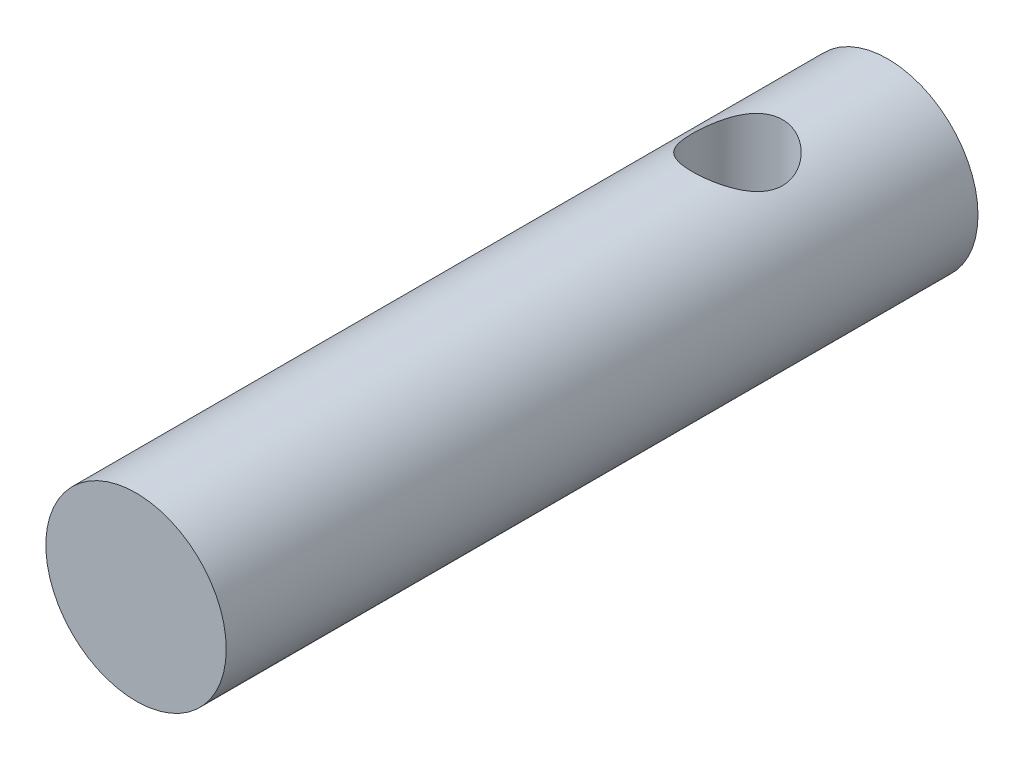
ISO-10303-21;
HEADER;
FILE_DESCRIPTION(('STEP AP214'),'2;1');
FILE_NAME('part.step','',(''),(''),'','','');
FILE_SCHEMA(('AUTOMOTIVE_DESIGN { 1 0 10303 214 1 1 1 1 }'));
ENDSEC;
DATA;
#1=APPLICATION_CONTEXT('core data for automotive mechanical design processes');
#2=APPLICATION_PROTOCOL_DEFINITION('international standard','automotive_design',2000,#1);
#3=PRODUCT_CONTEXT('',#1,'mechanical');
#4=PRODUCT('Part','Part','',(#3));
#5=PRODUCT_RELATED_PRODUCT_CATEGORY('part','',(#4));
#6=PRODUCT_DEFINITION_FORMATION('','',#4);
#7=PRODUCT_DEFINITION_CONTEXT('part definition',#1,'design');
#8=PRODUCT_DEFINITION('design','',#6,#7);
#9=PRODUCT_DEFINITION_SHAPE('','',#8);
#10=(LENGTH_UNIT() NAMED_UNIT(*) SI_UNIT(.MILLI.,.METRE.));
#11=(NAMED_UNIT(*) PLANE_ANGLE_UNIT() SI_UNIT($,.RADIAN.));
#12=(NAMED_UNIT(*) SI_UNIT($,.STERADIAN.) SOLID_ANGLE_UNIT());
#13=UNCERTAINTY_MEASURE_WITH_UNIT(LENGTH_MEASURE(1.E-05),#10,'distance_accuracy_value','');
#14=(GEOMETRIC_REPRESENTATION_CONTEXT(3) GLOBAL_UNCERTAINTY_ASSIGNED_CONTEXT((#13)) GLOBAL_UNIT_ASSIGNED_CONTEXT((#10,
#11,#12)) REPRESENTATION_CONTEXT('',''));
#15=CARTESIAN_POINT('',(0.,0.,0.));
#16=DIRECTION('',(0.,0.,1.));
#17=DIRECTION('',(1.,0.,0.));
#18=AXIS2_PLACEMENT_3D('',#15,#16,#17);
#19=CARTESIAN_POINT('',(0.,0.,25.));
#20=DIRECTION('',(0.,0.,-1.));
#21=DIRECTION('',(-1.,0.,0.));
#22=AXIS2_PLACEMENT_3D('',#19,#20,#21);
#23=CYLINDRICAL_SURFACE('',#22,3.);
#24=CARTESIAN_POINT('',(0.,-3.,6.5));
#25=CARTESIAN_POINT('',(0.0788579444268502,-2.99999570107562,6.49999504652421));
#26=CARTESIAN_POINT('',(0.157809899546344,-2.99685736529635,6.49374489031842));
#27=CARTESIAN_POINT('',(0.313380352903344,-2.98461234055736,6.46902067948769));
#28=CARTESIAN_POINT('',(0.389994130070444,-2.97549431743379,6.45052341050328));
#29=CARTESIAN_POINT('',(0.538400317320674,-2.95224419105063,6.40220928707506));
#30=CARTESIAN_POINT('',(0.61021020440872,-2.93813158766306,6.37243642362805));
#31=CARTESIAN_POINT('',(0.747708925209898,-2.90618664773642,6.30264406795252));
#32=CARTESIAN_POINT('',(0.813398240985089,-2.88835460450288,6.2626253836267));
#33=CARTESIAN_POINT('',(0.941261726642864,-2.84934387387093,6.17072412577207));
#34=CARTESIAN_POINT('',(1.00298281668316,-2.82802798691306,6.11827028114054));
#35=CARTESIAN_POINT('',(1.11716916730047,-2.78489955370115,6.00421778112945));
#36=CARTESIAN_POINT('',(1.16962737466015,-2.76308664313552,5.94261222234134));
#37=CARTESIAN_POINT('',(1.26787800067542,-2.71948426796021,5.80627497571493));
#38=CARTESIAN_POINT('',(1.31283800332746,-2.69782780455198,5.73089585248113));
#39=CARTESIAN_POINT('',(1.38925234033604,-2.65928968158481,5.57244899602068));
#40=CARTESIAN_POINT('',(1.4207163224495,-2.64240461410484,5.48938680691588));
#41=CARTESIAN_POINT('',(1.46719866328288,-2.61686800556713,5.32300234186712));
#42=CARTESIAN_POINT('',(1.48308878562066,-2.6077840737557,5.23999332189891));
#43=CARTESIAN_POINT('',(1.50064048996327,-2.59772834922792,5.07203174333078));
#44=CARTESIAN_POINT('',(1.50231613255961,-2.59674854014932,4.98708118869327));
#45=CARTESIAN_POINT('',(1.49203093075844,-2.60266395385873,4.82857096352695));
#46=CARTESIAN_POINT('',(1.48167683930523,-2.6086314549302,4.75486395316543));
#47=CARTESIAN_POINT('',(1.4504097735854,-2.62614343100775,4.61041713594044));
#48=CARTESIAN_POINT('',(1.42949343584648,-2.63768968247664,4.53967828204203));
#49=CARTESIAN_POINT('',(1.37731467057901,-2.66531214619112,4.40115630115151));
#50=CARTESIAN_POINT('',(1.34582260067399,-2.68148760995998,4.33348040182132));
#51=CARTESIAN_POINT('',(1.273562531502,-2.71655106422106,4.20404856111499));
#52=CARTESIAN_POINT('',(1.2327903657187,-2.73544027170286,4.14229529659987));
#53=CARTESIAN_POINT('',(1.13709908236918,-2.77669736854929,4.01821812088516));
#54=CARTESIAN_POINT('',(1.08104168755392,-2.79920265355119,3.95681468963576));
#55=CARTESIAN_POINT('',(0.95933336811206,-2.84321434950611,3.84389687211365));
#56=CARTESIAN_POINT('',(0.893677884861428,-2.86472027938201,3.79238721194918));
#57=CARTESIAN_POINT('',(0.750774758747773,-2.90552980924446,3.69847150845541));
#58=CARTESIAN_POINT('',(0.673130387399113,-2.92468476243011,3.65659929133139));
#59=CARTESIAN_POINT('',(0.510699323233195,-2.95736821681863,3.58685445643549));
#60=CARTESIAN_POINT('',(0.425918364397914,-2.9709011841533,3.55897072247725));
#61=CARTESIAN_POINT('',(0.259149737491053,-2.98986500612153,3.52028689442499));
#62=CARTESIAN_POINT('',(0.177512295822489,-2.99587407451965,3.50826314637983));
#63=CARTESIAN_POINT('',(0.0131693999240275,-3.00109520188655,3.49780290329827));
#64=CARTESIAN_POINT('',(-0.0695355298048631,-3.00031048081978,3.4993599715408));
#65=CARTESIAN_POINT('',(-0.22684945797898,-2.99236788380152,3.51531003262812));
#66=CARTESIAN_POINT('',(-0.301589112074895,-2.98570868532252,3.52869879909499));
#67=CARTESIAN_POINT('',(-0.447610338452912,-2.9673325697226,3.56635710784268));
#68=CARTESIAN_POINT('',(-0.518891528536631,-2.95561509501618,3.59062784968024));
#69=CARTESIAN_POINT('',(-0.658332912674359,-2.92776377120382,3.64999769964955));
#70=CARTESIAN_POINT('',(-0.726345595508705,-2.91151322654446,3.68538657517443));
#71=CARTESIAN_POINT('',(-0.855692042548907,-2.87615961476126,3.76566130346985));
#72=CARTESIAN_POINT('',(-0.917022944664887,-2.85705533350407,3.81055120189309));
#73=CARTESIAN_POINT('',(-1.03765153393382,-2.81562332004297,3.91364063799607));
#74=CARTESIAN_POINT('',(-1.09615811672854,-2.79316327265249,3.97271430266772));
#75=CARTESIAN_POINT('',(-1.20278448167828,-2.7489358741323,4.09988772691659));
#76=CARTESIAN_POINT('',(-1.25089707856781,-2.72716901100071,4.16799367827188));
#77=CARTESIAN_POINT('',(-1.33756187171853,-2.68576788309734,4.31546548125946));
#78=CARTESIAN_POINT('',(-1.37553824370037,-2.66628794383591,4.39521689914172));
#79=CARTESIAN_POINT('',(-1.43712423890206,-2.63361108441202,4.56126510136245));
#80=CARTESIAN_POINT('',(-1.46075237380052,-2.62040607332625,4.64755328970034));
#81=CARTESIAN_POINT('',(-1.49079253120031,-2.60342251538703,4.81536533432706));
#82=CARTESIAN_POINT('',(-1.49863949460818,-2.59886075197597,4.89655138015286));
#83=CARTESIAN_POINT('',(-1.5010337315643,-2.59748031962405,5.05917060074679));
#84=CARTESIAN_POINT('',(-1.49558676993486,-2.60065829439585,5.14060365310679));
#85=CARTESIAN_POINT('',(-1.47288918838996,-2.61356793076615,5.29322525230016));
#86=CARTESIAN_POINT('',(-1.45681247151455,-2.62264641723988,5.36465070521711));
#87=CARTESIAN_POINT('',(-1.41476303733662,-2.64556524281479,5.50371217913655));
#88=CARTESIAN_POINT('',(-1.38878713673988,-2.65940711354503,5.57134697313805));
#89=CARTESIAN_POINT('',(-1.32572361795085,-2.69142795546804,5.70593727647981));
#90=CARTESIAN_POINT('',(-1.28800670672355,-2.70983583593881,5.77254185274354));
#91=CARTESIAN_POINT('',(-1.20322645745609,-2.74852997452291,5.89891180427189));
#92=CARTESIAN_POINT('',(-1.15615825686234,-2.76881720693416,5.95867359578167));
#93=CARTESIAN_POINT('',(-1.04730498999206,-2.81193484737138,6.07721297353201));
#94=CARTESIAN_POINT('',(-0.984426634495892,-2.83477474959942,6.13498865352544));
#95=CARTESIAN_POINT('',(-0.849232209349796,-2.87816628389896,6.2393944751529));
#96=CARTESIAN_POINT('',(-0.776911084957796,-2.89871667939293,6.28601860920486));
#97=CARTESIAN_POINT('',(-0.623897395174419,-2.93547014349806,6.3668545440681));
#98=CARTESIAN_POINT('',(-0.543149255665096,-2.95164144740899,6.4009762538547));
#99=CARTESIAN_POINT('',(-0.37611315170713,-2.9775201194848,6.45471225163611));
#100=CARTESIAN_POINT('',(-0.28984169938365,-2.98724585044602,6.47436777020857));
#101=CARTESIAN_POINT('',(-0.168902919736342,-2.99543192870217,6.49084611662861));
#102=CARTESIAN_POINT('',(-0.135242819162347,-2.99714048010376,6.49427396129951));
#103=CARTESIAN_POINT('',(-0.0677275977076368,-2.99942545465223,6.49885199827113));
#104=CARTESIAN_POINT('',(-0.0338724714699424,-3.00000184655071,6.50000212770531));
#105=CARTESIAN_POINT('',(0.,-3.,6.5));
#106=B_SPLINE_CURVE_WITH_KNOTS('',3,(#24,#25,#26,#27,#28,#29,#30,#31,#32,#33,#34,#35,#36,#37,
#38,#39,#40,#41,#42,#43,#44,#45,#46,#47,#48,#49,#50,#51,#52,#53,#54,#55,#56,#57,#58,#59,#60,#61,
#62,#63,#64,#65,#66,#67,#68,#69,#70,#71,#72,#73,#74,#75,#76,#77,#78,#79,#80,#81,#82,#83,#84,#85,
#86,#87,#88,#89,#90,#91,#92,#93,#94,#95,#96,#97,#98,#99,#100,#101,#102,#103,#104,#105),
.UNSPECIFIED.,.T.,.F.,(4,2,2,2,2,2,2,2,2,2,2,2,2,2,2,2,2,2,2,2,2,2,2,2,2,2,2,2,2,2,2,2,2,2,2,2,
2,2,2,2,4),(0.,0.236436386130439,0.473322224563796,0.709293233238448,0.945245640872351,
1.19547263807713,1.44588935648105,1.71572589646129,1.98536921847421,2.23887018210344,
2.49212035993531,2.71508568613981,2.93812205888518,3.16635360252731,3.39468781890333,
3.65197412000818,3.90938301898029,4.17874533321661,4.44789325368419,4.69474935707018,
4.94148846767214,5.16910359759183,5.39674382446397,5.63089284041848,5.86514176122509,
6.12239415966628,6.37982382923148,6.64972023242589,6.91926767918176,7.1629396125457,
7.40650589797017,7.62686895373284,7.84730293182527,8.08254685170431,8.31791341715446,
8.58187864135757,8.84598575071869,9.1119602049529,9.37717362931724,9.47872920200875,
9.58028757766599),.UNSPECIFIED.);
#107=CARTESIAN_POINT('',(0.,-3.,6.5));
#108=VERTEX_POINT('',#107);
#109=EDGE_CURVE('E10',#108,#108,#106,.T.);
#110=ORIENTED_EDGE('',*,*,#109,.T.);
#111=EDGE_LOOP('',(#110));
#112=FACE_BOUND('',#111,.T.);
#113=CARTESIAN_POINT('',(0.,3.,6.5));
#114=CARTESIAN_POINT('',(-0.0788579444268503,2.99999570107561,6.49999504652421));
#115=CARTESIAN_POINT('',(-0.157809899546344,2.99685736529635,6.49374489031842));
#116=CARTESIAN_POINT('',(-0.313380352903344,2.98461234055736,6.46902067948769));
#117=CARTESIAN_POINT('',(-0.389994130070445,2.97549431743379,6.45052341050328));
#118=CARTESIAN_POINT('',(-0.538400317320674,2.95224419105063,6.40220928707506));
#119=CARTESIAN_POINT('',(-0.61021020440872,2.93813158766306,6.37243642362805));
#120=CARTESIAN_POINT('',(-0.747708925209898,2.90618664773642,6.30264406795252));
#121=CARTESIAN_POINT('',(-0.813398240985089,2.88835460450288,6.2626253836267));
#122=CARTESIAN_POINT('',(-0.941261726642864,2.84934387387093,6.17072412577207));
#123=CARTESIAN_POINT('',(-1.00298281668316,2.82802798691306,6.11827028114054));
#124=CARTESIAN_POINT('',(-1.11716916730047,2.78489955370115,6.00421778112945));
#125=CARTESIAN_POINT('',(-1.16962737466015,2.76308664313552,5.94261222234134));
#126=CARTESIAN_POINT('',(-1.26787800067542,2.71948426796021,5.80627497571493));
#127=CARTESIAN_POINT('',(-1.31283800332746,2.69782780455198,5.73089585248113));
#128=CARTESIAN_POINT('',(-1.38925234033604,2.65928968158481,5.57244899602068));
#129=CARTESIAN_POINT('',(-1.4207163224495,2.64240461410484,5.48938680691588));
#130=CARTESIAN_POINT('',(-1.46719866328288,2.61686800556713,5.32300234186712));
#131=CARTESIAN_POINT('',(-1.48308878562066,2.6077840737557,5.23999332189891));
#132=CARTESIAN_POINT('',(-1.50064048996327,2.59772834922792,5.07203174333078));
#133=CARTESIAN_POINT('',(-1.50231613255961,2.59674854014932,4.98708118869327));
#134=CARTESIAN_POINT('',(-1.49203093075844,2.60266395385873,4.82857096352695));
#135=CARTESIAN_POINT('',(-1.48167683930523,2.6086314549302,4.75486395316543));
#136=CARTESIAN_POINT('',(-1.4504097735854,2.62614343100775,4.61041713594044));
#137=CARTESIAN_POINT('',(-1.42949343584648,2.63768968247664,4.53967828204203));
#138=CARTESIAN_POINT('',(-1.37731467057901,2.66531214619112,4.40115630115151));
#139=CARTESIAN_POINT('',(-1.34582260067399,2.68148760995998,4.33348040182132));
#140=CARTESIAN_POINT('',(-1.273562531502,2.71655106422106,4.20404856111499));
#141=CARTESIAN_POINT('',(-1.2327903657187,2.73544027170286,4.14229529659987));
#142=CARTESIAN_POINT('',(-1.13709908236918,2.77669736854929,4.01821812088516));
#143=CARTESIAN_POINT('',(-1.08104168755392,2.79920265355119,3.95681468963576));
#144=CARTESIAN_POINT('',(-0.959333368112061,2.84321434950611,3.84389687211365));
#145=CARTESIAN_POINT('',(-0.893677884861429,2.86472027938201,3.79238721194918));
#146=CARTESIAN_POINT('',(-0.750774758747773,2.90552980924446,3.69847150845541));
#147=CARTESIAN_POINT('',(-0.673130387399113,2.92468476243011,3.65659929133139));
#148=CARTESIAN_POINT('',(-0.510699323233195,2.95736821681863,3.58685445643549));
#149=CARTESIAN_POINT('',(-0.425918364397914,2.9709011841533,3.55897072247725));
#150=CARTESIAN_POINT('',(-0.259149737491053,2.98986500612153,3.52028689442499));
#151=CARTESIAN_POINT('',(-0.177512295822489,2.99587407451965,3.50826314637983));
#152=CARTESIAN_POINT('',(-0.0131693999240276,3.00109520188655,3.49780290329827));
#153=CARTESIAN_POINT('',(0.0695355298048629,3.00031048081978,3.4993599715408));
#154=CARTESIAN_POINT('',(0.22684945797898,2.99236788380152,3.51531003262812));
#155=CARTESIAN_POINT('',(0.301589112074895,2.98570868532253,3.52869879909499));
#156=CARTESIAN_POINT('',(0.447610338452911,2.9673325697226,3.56635710784268));
#157=CARTESIAN_POINT('',(0.51889152853663,2.95561509501618,3.59062784968024));
#158=CARTESIAN_POINT('',(0.658332912674359,2.92776377120382,3.64999769964955));
#159=CARTESIAN_POINT('',(0.726345595508705,2.91151322654446,3.68538657517443));
#160=CARTESIAN_POINT('',(0.855692042548907,2.87615961476126,3.76566130346985));
#161=CARTESIAN_POINT('',(0.917022944664888,2.85705533350407,3.81055120189309));
#162=CARTESIAN_POINT('',(1.03765153393382,2.81562332004297,3.91364063799607));
#163=CARTESIAN_POINT('',(1.09615811672854,2.79316327265249,3.97271430266772));
#164=CARTESIAN_POINT('',(1.20278448167828,2.7489358741323,4.09988772691659));
#165=CARTESIAN_POINT('',(1.25089707856781,2.72716901100071,4.16799367827188));
#166=CARTESIAN_POINT('',(1.33756187171853,2.68576788309734,4.31546548125946));
#167=CARTESIAN_POINT('',(1.37553824370037,2.66628794383591,4.39521689914172));
#168=CARTESIAN_POINT('',(1.43712423890206,2.63361108441202,4.56126510136245));
#169=CARTESIAN_POINT('',(1.46075237380052,2.62040607332625,4.64755328970034));
#170=CARTESIAN_POINT('',(1.49079253120031,2.60342251538703,4.81536533432706));
#171=CARTESIAN_POINT('',(1.49863949460818,2.59886075197597,4.89655138015286));
#172=CARTESIAN_POINT('',(1.5010337315643,2.59748031962405,5.05917060074679));
#173=CARTESIAN_POINT('',(1.49558676993486,2.60065829439585,5.14060365310679));
#174=CARTESIAN_POINT('',(1.47288918838996,2.61356793076615,5.29322525230016));
#175=CARTESIAN_POINT('',(1.45681247151455,2.62264641723988,5.36465070521711));
#176=CARTESIAN_POINT('',(1.41476303733662,2.64556524281479,5.50371217913655));
#177=CARTESIAN_POINT('',(1.38878713673988,2.65940711354503,5.57134697313805));
#178=CARTESIAN_POINT('',(1.32572361795085,2.69142795546804,5.70593727647981));
#179=CARTESIAN_POINT('',(1.28800670672355,2.70983583593881,5.77254185274354));
#180=CARTESIAN_POINT('',(1.20322645745609,2.74852997452291,5.89891180427189));
#181=CARTESIAN_POINT('',(1.15615825686234,2.76881720693416,5.95867359578167));
#182=CARTESIAN_POINT('',(1.04730498999206,2.81193484737138,6.07721297353201));
#183=CARTESIAN_POINT('',(0.984426634495892,2.83477474959942,6.13498865352544));
#184=CARTESIAN_POINT('',(0.849232209349796,2.87816628389896,6.2393944751529));
#185=CARTESIAN_POINT('',(0.776911084957796,2.89871667939293,6.28601860920486));
#186=CARTESIAN_POINT('',(0.623897395174419,2.93547014349806,6.3668545440681));
#187=CARTESIAN_POINT('',(0.543149255665096,2.95164144740899,6.4009762538547));
#188=CARTESIAN_POINT('',(0.37611315170713,2.9775201194848,6.45471225163611));
#189=CARTESIAN_POINT('',(0.28984169938365,2.98724585044602,6.47436777020857));
#190=CARTESIAN_POINT('',(0.168902919736342,2.99543192870217,6.49084611662861));
#191=CARTESIAN_POINT('',(0.135242819162347,2.99714048010376,6.49427396129951));
#192=CARTESIAN_POINT('',(0.0677275977076368,2.99942545465223,6.49885199827113));
#193=CARTESIAN_POINT('',(0.0338724714699424,3.00000184655071,6.50000212770531));
#194=CARTESIAN_POINT('',(0.,3.,6.5));
#195=B_SPLINE_CURVE_WITH_KNOTS('',3,(#113,#114,#115,#116,#117,#118,#119,#120,#121,#122,#123,
#124,#125,#126,#127,#128,#129,#130,#131,#132,#133,#134,#135,#136,#137,#138,#139,#140,#141,#142,
#143,#144,#145,#146,#147,#148,#149,#150,#151,#152,#153,#154,#155,#156,#157,#158,#159,#160,#161,
#162,#163,#164,#165,#166,#167,#168,#169,#170,#171,#172,#173,#174,#175,#176,#177,#178,#179,#180,
#181,#182,#183,#184,#185,#186,#187,#188,#189,#190,#191,#192,#193,#194),.UNSPECIFIED.,.T.,.F.,(4,
2,2,2,2,2,2,2,2,2,2,2,2,2,2,2,2,2,2,2,2,2,2,2,2,2,2,2,2,2,2,2,2,2,2,2,2,2,2,2,4),(0.,
0.236436386130439,0.473322224563797,0.709293233238448,0.945245640872352,1.19547263807713,
1.44588935648105,1.71572589646129,1.98536921847421,2.23887018210344,2.49212035993531,
2.71508568613981,2.93812205888518,3.16635360252731,3.39468781890333,3.65197412000818,
3.90938301898029,4.17874533321661,4.44789325368419,4.69474935707018,4.94148846767214,
5.16910359759183,5.39674382446397,5.63089284041848,5.86514176122509,6.12239415966628,
6.37982382923148,6.64972023242589,6.91926767918176,7.1629396125457,7.40650589797017,
7.62686895373283,7.84730293182526,8.08254685170431,8.31791341715446,8.58187864135757,
8.84598575071868,9.1119602049529,9.37717362931724,9.47872920200875,9.58028757766599),.UNSPECIFIED.);
#196=CARTESIAN_POINT('',(0.,3.,6.5));
#197=VERTEX_POINT('',#196);
#198=EDGE_CURVE('E44',#197,#197,#195,.T.);
#199=ORIENTED_EDGE('',*,*,#198,.T.);
#200=EDGE_LOOP('',(#199));
#201=FACE_BOUND('',#200,.T.);
#202=CARTESIAN_POINT('',(0.,0.,25.));
#203=DIRECTION('',(0.,0.,1.));
#204=DIRECTION('',(1.,0.,0.));
#205=AXIS2_PLACEMENT_3D('',#202,#203,#204);
#206=CIRCLE('',#205,3.);
#207=CARTESIAN_POINT('',(3.,0.,25.));
#208=VERTEX_POINT('',#207);
#209=EDGE_CURVE('E48',#208,#208,#206,.T.);
#210=ORIENTED_EDGE('',*,*,#209,.F.);
#211=EDGE_LOOP('',(#210));
#212=FACE_BOUND('',#211,.T.);
#213=CARTESIAN_POINT('',(0.,0.,0.));
#214=DIRECTION('',(0.,0.,1.));
#215=DIRECTION('',(1.,0.,0.));
#216=AXIS2_PLACEMENT_3D('',#213,#214,#215);
#217=CIRCLE('',#216,3.);
#218=CARTESIAN_POINT('',(3.,0.,0.));
#219=VERTEX_POINT('',#218);
#220=EDGE_CURVE('E52',#219,#219,#217,.T.);
#221=ORIENTED_EDGE('',*,*,#220,.T.);
#222=EDGE_LOOP('',(#221));
#223=FACE_BOUND('',#222,.T.);
#224=ADVANCED_FACE('F33',(#112,#201,#212,#223),#23,.T.);
#225=CARTESIAN_POINT('',(0.,0.,25.));
#226=DIRECTION('',(0.,0.,1.));
#227=DIRECTION('',(1.,0.,0.));
#228=AXIS2_PLACEMENT_3D('',#225,#226,#227);
#229=PLANE('',#228);
#230=ORIENTED_EDGE('',*,*,#209,.T.);
#231=EDGE_LOOP('',(#230));
#232=FACE_BOUND('',#231,.T.);
#233=ADVANCED_FACE('F64',(#232),#229,.T.);
#234=CARTESIAN_POINT('',(0.,0.,0.));
#235=DIRECTION('',(0.,0.,1.));
#236=DIRECTION('',(1.,0.,0.));
#237=AXIS2_PLACEMENT_3D('',#234,#235,#236);
#238=PLANE('',#237);
#239=ORIENTED_EDGE('',*,*,#220,.F.);
#240=EDGE_LOOP('',(#239));
#241=FACE_BOUND('',#240,.T.);
#242=ADVANCED_FACE('F62',(#241),#238,.F.);
#243=CARTESIAN_POINT('',(0.,-3.,5.));
#244=DIRECTION('',(0.,1.,0.));
#245=DIRECTION('',(0.,0.,1.));
#246=AXIS2_PLACEMENT_3D('',#243,#244,#245);
#247=CYLINDRICAL_SURFACE('',#246,1.5);
#248=ORIENTED_EDGE('',*,*,#198,.F.);
#249=EDGE_LOOP('',(#248));
#250=FACE_BOUND('',#249,.T.);
#251=ORIENTED_EDGE('',*,*,#109,.F.);
#252=EDGE_LOOP('',(#251));
#253=FACE_BOUND('',#252,.T.);
#254=ADVANCED_FACE('F58',(#250,#253),#247,.F.);
#255=CLOSED_SHELL('',(#224,#233,#242,#254));
#256=MANIFOLD_SOLID_BREP('B2',#255);
#257=ADVANCED_BREP_SHAPE_REPRESENTATION('',(#18,#256),#14);
#258=SHAPE_DEFINITION_REPRESENTATION(#9,#257);
ENDSEC;
END-ISO-10303-21;
